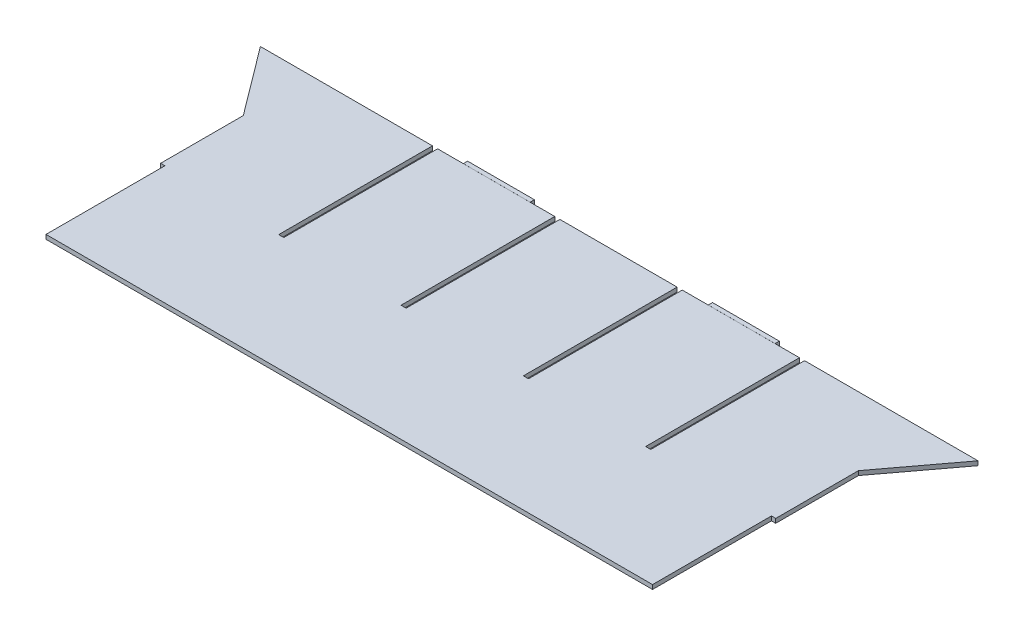
ISO-10303-21;
HEADER;
FILE_DESCRIPTION(('STEP AP214'),'2;1');
FILE_NAME('part.step','',(''),(''),'','','');
FILE_SCHEMA(('AUTOMOTIVE_DESIGN { 1 0 10303 214 1 1 1 1 }'));
ENDSEC;
DATA;
#1=APPLICATION_CONTEXT('core data for automotive mechanical design processes');
#2=APPLICATION_PROTOCOL_DEFINITION('international standard','automotive_design',2000,#1);
#3=PRODUCT_CONTEXT('',#1,'mechanical');
#4=PRODUCT('Part','Part','',(#3));
#5=PRODUCT_RELATED_PRODUCT_CATEGORY('part','',(#4));
#6=PRODUCT_DEFINITION_FORMATION('','',#4);
#7=PRODUCT_DEFINITION_CONTEXT('part definition',#1,'design');
#8=PRODUCT_DEFINITION('design','',#6,#7);
#9=PRODUCT_DEFINITION_SHAPE('','',#8);
#10=(LENGTH_UNIT() NAMED_UNIT(*) SI_UNIT(.MILLI.,.METRE.));
#11=(NAMED_UNIT(*) PLANE_ANGLE_UNIT() SI_UNIT($,.RADIAN.));
#12=(NAMED_UNIT(*) SI_UNIT($,.STERADIAN.) SOLID_ANGLE_UNIT());
#13=UNCERTAINTY_MEASURE_WITH_UNIT(LENGTH_MEASURE(1.E-05),#10,'distance_accuracy_value','');
#14=(GEOMETRIC_REPRESENTATION_CONTEXT(3) GLOBAL_UNCERTAINTY_ASSIGNED_CONTEXT((#13)) GLOBAL_UNIT_ASSIGNED_CONTEXT((#10,
#11,#12)) REPRESENTATION_CONTEXT('',''));
#15=CARTESIAN_POINT('',(0.,0.,0.));
#16=DIRECTION('',(0.,0.,1.));
#17=DIRECTION('',(1.,0.,0.));
#18=AXIS2_PLACEMENT_3D('',#15,#16,#17);
#19=CARTESIAN_POINT('',(0.,0.,0.));
#20=DIRECTION('',(0.,0.,-1.));
#21=DIRECTION('',(-1.,0.,0.));
#22=AXIS2_PLACEMENT_3D('',#19,#20,#21);
#23=PLANE('',#22);
#24=DIRECTION('',(-1.,0.,0.));
#25=VECTOR('',#24,1.);
#26=CARTESIAN_POINT('',(-66.1906883664823,-1.55825959399997,0.));
#27=LINE('',#26,#25);
#28=CARTESIAN_POINT('',(-66.1906883664823,-1.55825959399997,0.));
#29=VERTEX_POINT('',#28);
#30=CARTESIAN_POINT('',(-115.849499972,-1.55825959399997,0.));
#31=VERTEX_POINT('',#30);
#32=EDGE_CURVE('E304',#29,#31,#27,.T.);
#33=ORIENTED_EDGE('',*,*,#32,.F.);
#34=DIRECTION('',(0.,1.,0.));
#35=VECTOR('',#34,1.);
#36=CARTESIAN_POINT('',(-66.1906883664823,0.,0.));
#37=LINE('',#36,#35);
#38=CARTESIAN_POINT('',(-66.1906883664823,1.5875,0.));
#39=VERTEX_POINT('',#38);
#40=EDGE_CURVE('E11',#29,#39,#37,.T.);
#41=ORIENTED_EDGE('',*,*,#40,.T.);
#42=DIRECTION('',(-1.,0.,0.));
#43=VECTOR('',#42,1.);
#44=CARTESIAN_POINT('',(-228.6010033,1.5875,0.));
#45=LINE('',#44,#43);
#46=CARTESIAN_POINT('',(-47.8779967,1.5875,0.));
#47=VERTEX_POINT('',#46);
#48=EDGE_CURVE('E552',#47,#39,#45,.T.);
#49=ORIENTED_EDGE('',*,*,#48,.F.);
#50=DIRECTION('',(0.,1.,0.));
#51=VECTOR('',#50,1.);
#52=CARTESIAN_POINT('',(-47.8779967,-1.5875,0.));
#53=LINE('',#52,#51);
#54=CARTESIAN_POINT('',(-47.8779967,-1.5875,0.));
#55=VERTEX_POINT('',#54);
#56=EDGE_CURVE('E455',#55,#47,#53,.T.);
#57=ORIENTED_EDGE('',*,*,#56,.F.);
#58=DIRECTION('',(1.,0.,0.));
#59=VECTOR('',#58,1.);
#60=CARTESIAN_POINT('',(-228.6010033,-1.5875,0.));
#61=LINE('',#60,#59);
#62=CARTESIAN_POINT('',(-134.9999967,-1.5875,0.));
#63=VERTEX_POINT('',#62);
#64=EDGE_CURVE('E524',#63,#55,#61,.T.);
#65=ORIENTED_EDGE('',*,*,#64,.F.);
#66=DIRECTION('',(0.,1.,0.));
#67=VECTOR('',#66,1.);
#68=CARTESIAN_POINT('',(-134.9999967,-1.5875,0.));
#69=LINE('',#68,#67);
#70=CARTESIAN_POINT('',(-134.9999967,1.5875,0.));
#71=VERTEX_POINT('',#70);
#72=EDGE_CURVE('E468',#63,#71,#69,.T.);
#73=ORIENTED_EDGE('',*,*,#72,.T.);
#74=CARTESIAN_POINT('',(-115.849499972,1.5875,0.));
#75=VERTEX_POINT('',#74);
#76=EDGE_CURVE('E521',#75,#71,#45,.T.);
#77=ORIENTED_EDGE('',*,*,#76,.F.);
#78=DIRECTION('',(0.,1.,0.));
#79=VECTOR('',#78,1.);
#80=CARTESIAN_POINT('',(-115.849499972,1.61674040599999,0.));
#81=LINE('',#80,#79);
#82=EDGE_CURVE('E308',#31,#75,#81,.T.);
#83=ORIENTED_EDGE('',*,*,#82,.F.);
#84=EDGE_LOOP('',(#33,#41,#49,#57,#65,#73,#77,#83));
#85=FACE_BOUND('',#84,.T.);
#86=ADVANCED_FACE('F42',(#85),#23,.T.);
#87=CARTESIAN_POINT('',(66.1906883664823,1.5875,0.));
#88=VERTEX_POINT('',#87);
#89=CARTESIAN_POINT('',(46.8640033,1.5875,0.));
#90=VERTEX_POINT('',#89);
#91=EDGE_CURVE('E550',#88,#90,#45,.T.);
#92=ORIENTED_EDGE('',*,*,#91,.F.);
#93=DIRECTION('',(0.,1.,0.));
#94=VECTOR('',#93,1.);
#95=CARTESIAN_POINT('',(66.1906883664823,1.61674040599999,0.));
#96=LINE('',#95,#94);
#97=CARTESIAN_POINT('',(66.1906883664823,-1.55825959399994,0.));
#98=VERTEX_POINT('',#97);
#99=EDGE_CURVE('E306',#98,#88,#96,.T.);
#100=ORIENTED_EDGE('',*,*,#99,.F.);
#101=DIRECTION('',(-1.,0.,0.));
#102=VECTOR('',#101,1.);
#103=CARTESIAN_POINT('',(66.1906883664823,-1.55825959399994,0.));
#104=LINE('',#103,#102);
#105=CARTESIAN_POINT('',(115.849499972,-1.55825959399997,0.));
#106=VERTEX_POINT('',#105);
#107=EDGE_CURVE('E322',#106,#98,#104,.T.);
#108=ORIENTED_EDGE('',*,*,#107,.F.);
#109=DIRECTION('',(0.,1.,0.));
#110=VECTOR('',#109,1.);
#111=CARTESIAN_POINT('',(115.849499972,0.,0.));
#112=LINE('',#111,#110);
#113=CARTESIAN_POINT('',(115.849499972,1.5875,0.));
#114=VERTEX_POINT('',#113);
#115=EDGE_CURVE('E50',#106,#114,#112,.T.);
#116=ORIENTED_EDGE('',*,*,#115,.T.);
#117=CARTESIAN_POINT('',(133.9860033,1.5875,0.));
#118=VERTEX_POINT('',#117);
#119=EDGE_CURVE('E520',#118,#114,#45,.T.);
#120=ORIENTED_EDGE('',*,*,#119,.F.);
#121=DIRECTION('',(0.,1.,0.));
#122=VECTOR('',#121,1.);
#123=CARTESIAN_POINT('',(133.9860033,-1.5875,0.));
#124=LINE('',#123,#122);
#125=CARTESIAN_POINT('',(133.9860033,-1.5875,0.));
#126=VERTEX_POINT('',#125);
#127=EDGE_CURVE('E505',#126,#118,#124,.T.);
#128=ORIENTED_EDGE('',*,*,#127,.F.);
#129=CARTESIAN_POINT('',(46.8640033,-1.5875,0.));
#130=VERTEX_POINT('',#129);
#131=EDGE_CURVE('E525',#130,#126,#61,.T.);
#132=ORIENTED_EDGE('',*,*,#131,.F.);
#133=DIRECTION('',(0.,1.,0.));
#134=VECTOR('',#133,1.);
#135=CARTESIAN_POINT('',(46.8640033,-1.5875,0.));
#136=LINE('',#135,#134);
#137=EDGE_CURVE('E414',#130,#90,#136,.T.);
#138=ORIENTED_EDGE('',*,*,#137,.T.);
#139=EDGE_LOOP('',(#92,#100,#108,#116,#120,#128,#132,#138));
#140=FACE_BOUND('',#139,.T.);
#141=ADVANCED_FACE('F538',(#140),#23,.T.);
#142=CARTESIAN_POINT('',(228.6010033,-1.5875,200.6419914));
#143=DIRECTION('',(-1.,0.,0.));
#144=DIRECTION('',(0.,0.,1.));
#145=AXIS2_PLACEMENT_3D('',#142,#143,#144);
#146=PLANE('',#145);
#147=DIRECTION('',(0.,-1.,0.));
#148=VECTOR('',#147,1.);
#149=CARTESIAN_POINT('',(228.6010033,1.5875,112.2499914));
#150=LINE('',#149,#148);
#151=CARTESIAN_POINT('',(228.6010033,1.5875,112.2499914));
#152=VERTEX_POINT('',#151);
#153=CARTESIAN_POINT('',(228.6010033,-1.5875,112.2499914));
#154=VERTEX_POINT('',#153);
#155=EDGE_CURVE('E356',#152,#154,#150,.T.);
#156=ORIENTED_EDGE('',*,*,#155,.T.);
#157=DIRECTION('',(0.,0.,-1.));
#158=VECTOR('',#157,1.);
#159=CARTESIAN_POINT('',(228.6010033,-1.5875,200.6419914));
#160=LINE('',#159,#158);
#161=CARTESIAN_POINT('',(228.6010033,-1.5875,50.8));
#162=VERTEX_POINT('',#161);
#163=EDGE_CURVE('E515',#154,#162,#160,.T.);
#164=ORIENTED_EDGE('',*,*,#163,.T.);
#165=DIRECTION('',(0.,-1.,0.));
#166=VECTOR('',#165,1.);
#167=CARTESIAN_POINT('',(228.6010033,1.5875,50.8));
#168=LINE('',#167,#166);
#169=CARTESIAN_POINT('',(228.6010033,1.5875,50.8));
#170=VERTEX_POINT('',#169);
#171=EDGE_CURVE('E387',#170,#162,#168,.T.);
#172=ORIENTED_EDGE('',*,*,#171,.F.);
#173=DIRECTION('',(0.,0.,-1.));
#174=VECTOR('',#173,1.);
#175=CARTESIAN_POINT('',(228.6010033,1.5875,200.6419914));
#176=LINE('',#175,#174);
#177=EDGE_CURVE('E531',#152,#170,#176,.T.);
#178=ORIENTED_EDGE('',*,*,#177,.F.);
#179=EDGE_LOOP('',(#156,#164,#172,#178));
#180=FACE_BOUND('',#179,.T.);
#181=ADVANCED_FACE('F44',(#180),#146,.F.);
#182=CARTESIAN_POINT('',(-228.6010033,1.5875,200.6419914));
#183=DIRECTION('',(0.,-1.,0.));
#184=DIRECTION('',(0.,0.,-1.));
#185=AXIS2_PLACEMENT_3D('',#182,#183,#184);
#186=PLANE('',#185);
#187=DIRECTION('',(-1.,0.,0.));
#188=VECTOR('',#187,1.);
#189=CARTESIAN_POINT('',(228.6010033,1.5875,112.2499914));
#190=LINE('',#189,#188);
#191=CARTESIAN_POINT('',(225.4260033,1.5875,112.2499914));
#192=VERTEX_POINT('',#191);
#193=EDGE_CURVE('E348',#152,#192,#190,.T.);
#194=ORIENTED_EDGE('',*,*,#193,.F.);
#195=ORIENTED_EDGE('',*,*,#177,.T.);
#196=DIRECTION('',(0.600000000000001,0.,-0.799999999999999));
#197=VECTOR('',#196,1.);
#198=CARTESIAN_POINT('',(266.7010033,1.5875,0.));
#199=LINE('',#198,#197);
#200=CARTESIAN_POINT('',(266.7010033,1.5875,0.));
#201=VERTEX_POINT('',#200);
#202=EDGE_CURVE('E381',#170,#201,#199,.T.);
#203=ORIENTED_EDGE('',*,*,#202,.T.);
#204=CARTESIAN_POINT('',(137.7960033,1.5875,0.));
#205=VERTEX_POINT('',#204);
#206=EDGE_CURVE('E516',#201,#205,#45,.T.);
#207=ORIENTED_EDGE('',*,*,#206,.T.);
#208=DIRECTION('',(0.,0.,1.));
#209=VECTOR('',#208,1.);
#210=CARTESIAN_POINT('',(137.7960033,1.5875,0.));
#211=LINE('',#210,#209);
#212=CARTESIAN_POINT('',(137.7960033,1.5875,114.3));
#213=VERTEX_POINT('',#212);
#214=EDGE_CURVE('E426',#205,#213,#211,.T.);
#215=ORIENTED_EDGE('',*,*,#214,.T.);
#216=DIRECTION('',(1.,0.,0.));
#217=VECTOR('',#216,1.);
#218=CARTESIAN_POINT('',(0.,1.5875,114.3));
#219=LINE('',#218,#217);
#220=CARTESIAN_POINT('',(133.9860033,1.5875,114.3));
#221=VERTEX_POINT('',#220);
#222=EDGE_CURVE('E486',#221,#213,#219,.T.);
#223=ORIENTED_EDGE('',*,*,#222,.F.);
#224=DIRECTION('',(0.,0.,1.));
#225=VECTOR('',#224,1.);
#226=CARTESIAN_POINT('',(133.9860033,1.5875,0.));
#227=LINE('',#226,#225);
#228=EDGE_CURVE('E495',#118,#221,#227,.T.);
#229=ORIENTED_EDGE('',*,*,#228,.F.);
#230=ORIENTED_EDGE('',*,*,#119,.T.);
#231=EDGE_CURVE('E547',#114,#88,#45,.T.);
#232=ORIENTED_EDGE('',*,*,#231,.T.);
#233=ORIENTED_EDGE('',*,*,#91,.T.);
#234=DIRECTION('',(0.,0.,1.));
#235=VECTOR('',#234,1.);
#236=CARTESIAN_POINT('',(46.8640033,1.5875,0.));
#237=LINE('',#236,#235);
#238=CARTESIAN_POINT('',(46.8640033,1.5875,114.3));
#239=VERTEX_POINT('',#238);
#240=EDGE_CURVE('E415',#90,#239,#237,.T.);
#241=ORIENTED_EDGE('',*,*,#240,.T.);
#242=DIRECTION('',(1.,0.,0.));
#243=VECTOR('',#242,1.);
#244=CARTESIAN_POINT('',(-90.932,1.5875,114.3));
#245=LINE('',#244,#243);
#246=CARTESIAN_POINT('',(43.0540033,1.5875,114.3));
#247=VERTEX_POINT('',#246);
#248=EDGE_CURVE('E408',#247,#239,#245,.T.);
#249=ORIENTED_EDGE('',*,*,#248,.F.);
#250=DIRECTION('',(0.,0.,1.));
#251=VECTOR('',#250,1.);
#252=CARTESIAN_POINT('',(43.0540033,1.5875,0.));
#253=LINE('',#252,#251);
#254=CARTESIAN_POINT('',(43.0540033,1.5875,0.));
#255=VERTEX_POINT('',#254);
#256=EDGE_CURVE('E418',#255,#247,#253,.T.);
#257=ORIENTED_EDGE('',*,*,#256,.F.);
#258=CARTESIAN_POINT('',(-44.0679967,1.5875,0.));
#259=VERTEX_POINT('',#258);
#260=EDGE_CURVE('E549',#255,#259,#45,.T.);
#261=ORIENTED_EDGE('',*,*,#260,.T.);
#262=DIRECTION('',(0.,0.,1.));
#263=VECTOR('',#262,1.);
#264=CARTESIAN_POINT('',(-44.0679967,1.5875,0.));
#265=LINE('',#264,#263);
#266=CARTESIAN_POINT('',(-44.0679967,1.5875,114.3));
#267=VERTEX_POINT('',#266);
#268=EDGE_CURVE('E443',#259,#267,#265,.T.);
#269=ORIENTED_EDGE('',*,*,#268,.T.);
#270=DIRECTION('',(1.,0.,0.));
#271=VECTOR('',#270,1.);
#272=CARTESIAN_POINT('',(-181.864,1.5875,114.3));
#273=LINE('',#272,#271);
#274=CARTESIAN_POINT('',(-47.8779967,1.5875,114.3));
#275=VERTEX_POINT('',#274);
#276=EDGE_CURVE('E436',#275,#267,#273,.T.);
#277=ORIENTED_EDGE('',*,*,#276,.F.);
#278=DIRECTION('',(0.,0.,1.));
#279=VECTOR('',#278,1.);
#280=CARTESIAN_POINT('',(-47.8779967,1.5875,0.));
#281=LINE('',#280,#279);
#282=EDGE_CURVE('E446',#47,#275,#281,.T.);
#283=ORIENTED_EDGE('',*,*,#282,.F.);
#284=ORIENTED_EDGE('',*,*,#48,.T.);
#285=EDGE_CURVE('E302',#39,#75,#45,.T.);
#286=ORIENTED_EDGE('',*,*,#285,.T.);
#287=ORIENTED_EDGE('',*,*,#76,.T.);
#288=DIRECTION('',(0.,0.,1.));
#289=VECTOR('',#288,1.);
#290=CARTESIAN_POINT('',(-134.9999967,1.5875,0.));
#291=LINE('',#290,#289);
#292=CARTESIAN_POINT('',(-134.9999967,1.5875,114.3));
#293=VERTEX_POINT('',#292);
#294=EDGE_CURVE('E402',#71,#293,#291,.T.);
#295=ORIENTED_EDGE('',*,*,#294,.T.);
#296=DIRECTION('',(1.,0.,0.));
#297=VECTOR('',#296,1.);
#298=CARTESIAN_POINT('',(-272.796,1.5875,114.3));
#299=LINE('',#298,#297);
#300=CARTESIAN_POINT('',(-138.8099967,1.5875,114.3));
#301=VERTEX_POINT('',#300);
#302=EDGE_CURVE('E462',#301,#293,#299,.T.);
#303=ORIENTED_EDGE('',*,*,#302,.F.);
#304=DIRECTION('',(0.,0.,1.));
#305=VECTOR('',#304,1.);
#306=CARTESIAN_POINT('',(-138.8099967,1.5875,0.));
#307=LINE('',#306,#305);
#308=CARTESIAN_POINT('',(-138.8099967,1.5875,0.));
#309=VERTEX_POINT('',#308);
#310=EDGE_CURVE('E471',#309,#301,#307,.T.);
#311=ORIENTED_EDGE('',*,*,#310,.F.);
#312=CARTESIAN_POINT('',(-266.7010033,1.5875,0.));
#313=VERTEX_POINT('',#312);
#314=EDGE_CURVE('E502',#309,#313,#45,.T.);
#315=ORIENTED_EDGE('',*,*,#314,.T.);
#316=DIRECTION('',(-0.600000000000001,0.,-0.799999999999999));
#317=VECTOR('',#316,1.);
#318=CARTESIAN_POINT('',(-266.7010033,1.5875,0.));
#319=LINE('',#318,#317);
#320=CARTESIAN_POINT('',(-228.6010033,1.5875,50.8));
#321=VERTEX_POINT('',#320);
#322=EDGE_CURVE('E393',#321,#313,#319,.T.);
#323=ORIENTED_EDGE('',*,*,#322,.F.);
#324=DIRECTION('',(0.,0.,-1.));
#325=VECTOR('',#324,1.);
#326=CARTESIAN_POINT('',(-228.6010033,1.5875,200.6419914));
#327=LINE('',#326,#325);
#328=CARTESIAN_POINT('',(-228.6010033,1.5875,112.2499914));
#329=VERTEX_POINT('',#328);
#330=EDGE_CURVE('E529',#329,#321,#327,.T.);
#331=ORIENTED_EDGE('',*,*,#330,.F.);
#332=DIRECTION('',(1.,0.,0.));
#333=VECTOR('',#332,1.);
#334=CARTESIAN_POINT('',(-228.6010033,1.5875,112.2499914));
#335=LINE('',#334,#333);
#336=CARTESIAN_POINT('',(-225.4260033,1.5875,112.2499914));
#337=VERTEX_POINT('',#336);
#338=EDGE_CURVE('E363',#329,#337,#335,.T.);
#339=ORIENTED_EDGE('',*,*,#338,.T.);
#340=DIRECTION('',(0.,0.,1.));
#341=VECTOR('',#340,1.);
#342=CARTESIAN_POINT('',(-225.4260033,1.5875,200.6419914));
#343=LINE('',#342,#341);
#344=CARTESIAN_POINT('',(-225.4260033,1.5875,200.6419914));
#345=VERTEX_POINT('',#344);
#346=EDGE_CURVE('E366',#337,#345,#343,.T.);
#347=ORIENTED_EDGE('',*,*,#346,.T.);
#348=DIRECTION('',(-1.,0.,0.));
#349=VECTOR('',#348,1.);
#350=CARTESIAN_POINT('',(-228.6010033,1.5875,200.6419914));
#351=LINE('',#350,#349);
#352=CARTESIAN_POINT('',(225.4260033,1.5875,200.6419914));
#353=VERTEX_POINT('',#352);
#354=EDGE_CURVE('E509',#353,#345,#351,.T.);
#355=ORIENTED_EDGE('',*,*,#354,.F.);
#356=DIRECTION('',(0.,0.,1.));
#357=VECTOR('',#356,1.);
#358=CARTESIAN_POINT('',(225.4260033,1.5875,200.6419914));
#359=LINE('',#358,#357);
#360=EDGE_CURVE('E346',#192,#353,#359,.T.);
#361=ORIENTED_EDGE('',*,*,#360,.F.);
#362=EDGE_LOOP('',(#194,#195,#203,#207,#215,#223,#229,#230,#232,#233,#241,#249,#257,#261,#269,
#277,#283,#284,#286,#287,#295,#303,#311,#315,#323,#331,#339,#347,#355,#361));
#363=FACE_BOUND('',#362,.T.);
#364=ADVANCED_FACE('F546',(#363),#186,.F.);
#365=CARTESIAN_POINT('',(-228.6010033,-1.5875,200.6419914));
#366=DIRECTION('',(0.,1.,0.));
#367=DIRECTION('',(0.,0.,1.));
#368=AXIS2_PLACEMENT_3D('',#365,#366,#367);
#369=PLANE('',#368);
#370=DIRECTION('',(-1.,0.,0.));
#371=VECTOR('',#370,1.);
#372=CARTESIAN_POINT('',(228.6010033,-1.5875,112.2499914));
#373=LINE('',#372,#371);
#374=CARTESIAN_POINT('',(225.4260033,-1.5875,112.2499914));
#375=VERTEX_POINT('',#374);
#376=EDGE_CURVE('E349',#154,#375,#373,.T.);
#377=ORIENTED_EDGE('',*,*,#376,.T.);
#378=DIRECTION('',(0.,0.,1.));
#379=VECTOR('',#378,1.);
#380=CARTESIAN_POINT('',(225.4260033,-1.5875,200.6419914));
#381=LINE('',#380,#379);
#382=CARTESIAN_POINT('',(225.4260033,-1.5875,200.6419914));
#383=VERTEX_POINT('',#382);
#384=EDGE_CURVE('E345',#375,#383,#381,.T.);
#385=ORIENTED_EDGE('',*,*,#384,.T.);
#386=DIRECTION('',(1.,0.,0.));
#387=VECTOR('',#386,1.);
#388=CARTESIAN_POINT('',(-228.6010033,-1.5875,200.6419914));
#389=LINE('',#388,#387);
#390=CARTESIAN_POINT('',(-225.4260033,-1.5875,200.6419914));
#391=VERTEX_POINT('',#390);
#392=EDGE_CURVE('E511',#391,#383,#389,.T.);
#393=ORIENTED_EDGE('',*,*,#392,.F.);
#394=DIRECTION('',(0.,0.,1.));
#395=VECTOR('',#394,1.);
#396=CARTESIAN_POINT('',(-225.4260033,-1.5875,200.6419914));
#397=LINE('',#396,#395);
#398=CARTESIAN_POINT('',(-225.4260033,-1.5875,112.2499914));
#399=VERTEX_POINT('',#398);
#400=EDGE_CURVE('E367',#399,#391,#397,.T.);
#401=ORIENTED_EDGE('',*,*,#400,.F.);
#402=DIRECTION('',(1.,0.,0.));
#403=VECTOR('',#402,1.);
#404=CARTESIAN_POINT('',(-228.6010033,-1.5875,112.2499914));
#405=LINE('',#404,#403);
#406=CARTESIAN_POINT('',(-228.6010033,-1.5875,112.2499914));
#407=VERTEX_POINT('',#406);
#408=EDGE_CURVE('E359',#407,#399,#405,.T.);
#409=ORIENTED_EDGE('',*,*,#408,.F.);
#410=DIRECTION('',(0.,0.,-1.));
#411=VECTOR('',#410,1.);
#412=CARTESIAN_POINT('',(-228.6010033,-1.5875,200.6419914));
#413=LINE('',#412,#411);
#414=CARTESIAN_POINT('',(-228.6010033,-1.5875,50.8));
#415=VERTEX_POINT('',#414);
#416=EDGE_CURVE('E527',#407,#415,#413,.T.);
#417=ORIENTED_EDGE('',*,*,#416,.T.);
#418=DIRECTION('',(-0.600000000000001,0.,-0.799999999999999));
#419=VECTOR('',#418,1.);
#420=CARTESIAN_POINT('',(-266.7010033,-1.5875,0.));
#421=LINE('',#420,#419);
#422=CARTESIAN_POINT('',(-266.7010033,-1.5875,0.));
#423=VERTEX_POINT('',#422);
#424=EDGE_CURVE('E390',#415,#423,#421,.T.);
#425=ORIENTED_EDGE('',*,*,#424,.T.);
#426=CARTESIAN_POINT('',(-138.8099967,-1.5875,0.));
#427=VERTEX_POINT('',#426);
#428=EDGE_CURVE('E512',#423,#427,#61,.T.);
#429=ORIENTED_EDGE('',*,*,#428,.T.);
#430=DIRECTION('',(0.,0.,1.));
#431=VECTOR('',#430,1.);
#432=CARTESIAN_POINT('',(-138.8099967,-1.5875,0.));
#433=LINE('',#432,#431);
#434=CARTESIAN_POINT('',(-138.8099967,-1.5875,114.3));
#435=VERTEX_POINT('',#434);
#436=EDGE_CURVE('E461',#427,#435,#433,.T.);
#437=ORIENTED_EDGE('',*,*,#436,.T.);
#438=DIRECTION('',(1.,0.,0.));
#439=VECTOR('',#438,1.);
#440=CARTESIAN_POINT('',(-272.796,-1.5875,114.3));
#441=LINE('',#440,#439);
#442=CARTESIAN_POINT('',(-134.9999967,-1.5875,114.3));
#443=VERTEX_POINT('',#442);
#444=EDGE_CURVE('E465',#435,#443,#441,.T.);
#445=ORIENTED_EDGE('',*,*,#444,.T.);
#446=DIRECTION('',(0.,0.,1.));
#447=VECTOR('',#446,1.);
#448=CARTESIAN_POINT('',(-134.9999967,-1.5875,0.));
#449=LINE('',#448,#447);
#450=EDGE_CURVE('E459',#63,#443,#449,.T.);
#451=ORIENTED_EDGE('',*,*,#450,.F.);
#452=ORIENTED_EDGE('',*,*,#64,.T.);
#453=DIRECTION('',(0.,0.,1.));
#454=VECTOR('',#453,1.);
#455=CARTESIAN_POINT('',(-47.8779967,-1.5875,0.));
#456=LINE('',#455,#454);
#457=CARTESIAN_POINT('',(-47.8779967,-1.5875,114.3));
#458=VERTEX_POINT('',#457);
#459=EDGE_CURVE('E435',#55,#458,#456,.T.);
#460=ORIENTED_EDGE('',*,*,#459,.T.);
#461=DIRECTION('',(1.,0.,0.));
#462=VECTOR('',#461,1.);
#463=CARTESIAN_POINT('',(-181.864,-1.5875,114.3));
#464=LINE('',#463,#462);
#465=CARTESIAN_POINT('',(-44.0679967,-1.5875,114.3));
#466=VERTEX_POINT('',#465);
#467=EDGE_CURVE('E439',#458,#466,#464,.T.);
#468=ORIENTED_EDGE('',*,*,#467,.T.);
#469=DIRECTION('',(0.,0.,1.));
#470=VECTOR('',#469,1.);
#471=CARTESIAN_POINT('',(-44.0679967,-1.5875,0.));
#472=LINE('',#471,#470);
#473=CARTESIAN_POINT('',(-44.0679967,-1.5875,0.));
#474=VERTEX_POINT('',#473);
#475=EDGE_CURVE('E433',#474,#466,#472,.T.);
#476=ORIENTED_EDGE('',*,*,#475,.F.);
#477=CARTESIAN_POINT('',(43.0540033,-1.5875,0.));
#478=VERTEX_POINT('',#477);
#479=EDGE_CURVE('E576',#474,#478,#61,.T.);
#480=ORIENTED_EDGE('',*,*,#479,.T.);
#481=DIRECTION('',(0.,0.,1.));
#482=VECTOR('',#481,1.);
#483=CARTESIAN_POINT('',(43.0540033,-1.5875,0.));
#484=LINE('',#483,#482);
#485=CARTESIAN_POINT('',(43.0540033,-1.5875,114.3));
#486=VERTEX_POINT('',#485);
#487=EDGE_CURVE('E407',#478,#486,#484,.T.);
#488=ORIENTED_EDGE('',*,*,#487,.T.);
#489=DIRECTION('',(1.,0.,0.));
#490=VECTOR('',#489,1.);
#491=CARTESIAN_POINT('',(-90.932,-1.5875,114.3));
#492=LINE('',#491,#490);
#493=CARTESIAN_POINT('',(46.8640033,-1.5875,114.3));
#494=VERTEX_POINT('',#493);
#495=EDGE_CURVE('E411',#486,#494,#492,.T.);
#496=ORIENTED_EDGE('',*,*,#495,.T.);
#497=DIRECTION('',(0.,0.,1.));
#498=VECTOR('',#497,1.);
#499=CARTESIAN_POINT('',(46.8640033,-1.5875,0.));
#500=LINE('',#499,#498);
#501=EDGE_CURVE('E405',#130,#494,#500,.T.);
#502=ORIENTED_EDGE('',*,*,#501,.F.);
#503=ORIENTED_EDGE('',*,*,#131,.T.);
#504=DIRECTION('',(0.,0.,1.));
#505=VECTOR('',#504,1.);
#506=CARTESIAN_POINT('',(133.9860033,-1.5875,0.));
#507=LINE('',#506,#505);
#508=CARTESIAN_POINT('',(133.9860033,-1.5875,114.3));
#509=VERTEX_POINT('',#508);
#510=EDGE_CURVE('E485',#126,#509,#507,.T.);
#511=ORIENTED_EDGE('',*,*,#510,.T.);
#512=DIRECTION('',(1.,0.,0.));
#513=VECTOR('',#512,1.);
#514=CARTESIAN_POINT('',(0.,-1.5875,114.3));
#515=LINE('',#514,#513);
#516=CARTESIAN_POINT('',(137.7960033,-1.5875,114.3));
#517=VERTEX_POINT('',#516);
#518=EDGE_CURVE('E489',#509,#517,#515,.T.);
#519=ORIENTED_EDGE('',*,*,#518,.T.);
#520=DIRECTION('',(0.,0.,1.));
#521=VECTOR('',#520,1.);
#522=CARTESIAN_POINT('',(137.7960033,-1.5875,0.));
#523=LINE('',#522,#521);
#524=CARTESIAN_POINT('',(137.7960033,-1.5875,0.));
#525=VERTEX_POINT('',#524);
#526=EDGE_CURVE('E483',#525,#517,#523,.T.);
#527=ORIENTED_EDGE('',*,*,#526,.F.);
#528=CARTESIAN_POINT('',(266.7010033,-1.5875,0.));
#529=VERTEX_POINT('',#528);
#530=EDGE_CURVE('E519',#525,#529,#61,.T.);
#531=ORIENTED_EDGE('',*,*,#530,.T.);
#532=DIRECTION('',(0.600000000000001,0.,-0.799999999999999));
#533=VECTOR('',#532,1.);
#534=CARTESIAN_POINT('',(266.7010033,-1.5875,0.));
#535=LINE('',#534,#533);
#536=EDGE_CURVE('E377',#162,#529,#535,.T.);
#537=ORIENTED_EDGE('',*,*,#536,.F.);
#538=ORIENTED_EDGE('',*,*,#163,.F.);
#539=EDGE_LOOP('',(#377,#385,#393,#401,#409,#417,#425,#429,#437,#445,#451,#452,#460,#468,#476,
#480,#488,#496,#502,#503,#511,#519,#527,#531,#537,#538));
#540=FACE_BOUND('',#539,.T.);
#541=ADVANCED_FACE('F584',(#540),#369,.F.);
#542=CARTESIAN_POINT('',(0.,0.,200.6419914));
#543=DIRECTION('',(0.,0.,-1.));
#544=DIRECTION('',(-1.,0.,0.));
#545=AXIS2_PLACEMENT_3D('',#542,#543,#544);
#546=PLANE('',#545);
#547=DIRECTION('',(0.,-1.,0.));
#548=VECTOR('',#547,1.);
#549=CARTESIAN_POINT('',(225.4260033,1.5875,200.6419914));
#550=LINE('',#549,#548);
#551=EDGE_CURVE('E351',#353,#383,#550,.T.);
#552=ORIENTED_EDGE('',*,*,#551,.F.);
#553=ORIENTED_EDGE('',*,*,#354,.T.);
#554=DIRECTION('',(0.,-1.,0.));
#555=VECTOR('',#554,1.);
#556=CARTESIAN_POINT('',(-225.4260033,1.5875,200.6419914));
#557=LINE('',#556,#555);
#558=EDGE_CURVE('E374',#345,#391,#557,.T.);
#559=ORIENTED_EDGE('',*,*,#558,.T.);
#560=ORIENTED_EDGE('',*,*,#392,.T.);
#561=EDGE_LOOP('',(#552,#553,#559,#560));
#562=FACE_BOUND('',#561,.T.);
#563=ADVANCED_FACE('F612',(#562),#546,.F.);
#564=DIRECTION('',(0.,1.,0.));
#565=VECTOR('',#564,1.);
#566=CARTESIAN_POINT('',(43.0540033,-1.5875,0.));
#567=LINE('',#566,#565);
#568=EDGE_CURVE('E429',#478,#255,#567,.T.);
#569=ORIENTED_EDGE('',*,*,#568,.F.);
#570=ORIENTED_EDGE('',*,*,#479,.F.);
#571=DIRECTION('',(0.,1.,0.));
#572=VECTOR('',#571,1.);
#573=CARTESIAN_POINT('',(-44.0679967,-1.5875,0.));
#574=LINE('',#573,#572);
#575=EDGE_CURVE('E442',#474,#259,#574,.T.);
#576=ORIENTED_EDGE('',*,*,#575,.T.);
#577=ORIENTED_EDGE('',*,*,#260,.F.);
#578=EDGE_LOOP('',(#569,#570,#576,#577));
#579=FACE_BOUND('',#578,.T.);
#580=ADVANCED_FACE('F655',(#579),#23,.T.);
#581=ORIENTED_EDGE('',*,*,#530,.F.);
#582=DIRECTION('',(0.,1.,0.));
#583=VECTOR('',#582,1.);
#584=CARTESIAN_POINT('',(137.7960033,-1.5875,0.));
#585=LINE('',#584,#583);
#586=EDGE_CURVE('E492',#525,#205,#585,.T.);
#587=ORIENTED_EDGE('',*,*,#586,.T.);
#588=ORIENTED_EDGE('',*,*,#206,.F.);
#589=DIRECTION('',(0.,-1.,0.));
#590=VECTOR('',#589,1.);
#591=CARTESIAN_POINT('',(266.7010033,1.5875,0.));
#592=LINE('',#591,#590);
#593=EDGE_CURVE('E384',#201,#529,#592,.T.);
#594=ORIENTED_EDGE('',*,*,#593,.T.);
#595=EDGE_LOOP('',(#581,#587,#588,#594));
#596=FACE_BOUND('',#595,.T.);
#597=ADVANCED_FACE('F593',(#596),#23,.T.);
#598=CARTESIAN_POINT('',(-228.6010033,-1.5875,200.6419914));
#599=DIRECTION('',(1.,0.,0.));
#600=DIRECTION('',(0.,0.,-1.));
#601=AXIS2_PLACEMENT_3D('',#598,#599,#600);
#602=PLANE('',#601);
#603=ORIENTED_EDGE('',*,*,#416,.F.);
#604=DIRECTION('',(0.,-1.,0.));
#605=VECTOR('',#604,1.);
#606=CARTESIAN_POINT('',(-228.6010033,1.5875,112.2499914));
#607=LINE('',#606,#605);
#608=EDGE_CURVE('E370',#329,#407,#607,.T.);
#609=ORIENTED_EDGE('',*,*,#608,.F.);
#610=ORIENTED_EDGE('',*,*,#330,.T.);
#611=DIRECTION('',(0.,-1.,0.));
#612=VECTOR('',#611,1.);
#613=CARTESIAN_POINT('',(-228.6010033,1.5875,50.8));
#614=LINE('',#613,#612);
#615=EDGE_CURVE('E396',#321,#415,#614,.T.);
#616=ORIENTED_EDGE('',*,*,#615,.T.);
#617=EDGE_LOOP('',(#603,#609,#610,#616));
#618=FACE_BOUND('',#617,.T.);
#619=ADVANCED_FACE('F626',(#618),#602,.F.);
#620=DIRECTION('',(0.,1.,0.));
#621=VECTOR('',#620,1.);
#622=CARTESIAN_POINT('',(-138.8099967,-1.5875,0.));
#623=LINE('',#622,#621);
#624=EDGE_CURVE('E479',#427,#309,#623,.T.);
#625=ORIENTED_EDGE('',*,*,#624,.F.);
#626=ORIENTED_EDGE('',*,*,#428,.F.);
#627=DIRECTION('',(0.,-1.,0.));
#628=VECTOR('',#627,1.);
#629=CARTESIAN_POINT('',(-266.7010033,1.5875,0.));
#630=LINE('',#629,#628);
#631=EDGE_CURVE('E399',#313,#423,#630,.T.);
#632=ORIENTED_EDGE('',*,*,#631,.F.);
#633=ORIENTED_EDGE('',*,*,#314,.F.);
#634=EDGE_LOOP('',(#625,#626,#632,#633));
#635=FACE_BOUND('',#634,.T.);
#636=ADVANCED_FACE('F633',(#635),#23,.T.);
#637=CARTESIAN_POINT('',(137.7960033,-1.5875,0.));
#638=DIRECTION('',(-1.,0.,0.));
#639=DIRECTION('',(0.,0.,1.));
#640=AXIS2_PLACEMENT_3D('',#637,#638,#639);
#641=PLANE('',#640);
#642=ORIENTED_EDGE('',*,*,#214,.F.);
#643=ORIENTED_EDGE('',*,*,#586,.F.);
#644=ORIENTED_EDGE('',*,*,#526,.T.);
#645=DIRECTION('',(0.,1.,0.));
#646=VECTOR('',#645,1.);
#647=CARTESIAN_POINT('',(137.7960033,-1.5875,114.3));
#648=LINE('',#647,#646);
#649=EDGE_CURVE('E500',#517,#213,#648,.T.);
#650=ORIENTED_EDGE('',*,*,#649,.T.);
#651=EDGE_LOOP('',(#642,#643,#644,#650));
#652=FACE_BOUND('',#651,.T.);
#653=ADVANCED_FACE('F659',(#652),#641,.T.);
#654=CARTESIAN_POINT('',(0.,-1.5875,114.3));
#655=DIRECTION('',(0.,0.,1.));
#656=DIRECTION('',(1.,0.,0.));
#657=AXIS2_PLACEMENT_3D('',#654,#655,#656);
#658=PLANE('',#657);
#659=ORIENTED_EDGE('',*,*,#222,.T.);
#660=ORIENTED_EDGE('',*,*,#649,.F.);
#661=ORIENTED_EDGE('',*,*,#518,.F.);
#662=DIRECTION('',(0.,1.,0.));
#663=VECTOR('',#662,1.);
#664=CARTESIAN_POINT('',(133.9860033,-1.5875,114.3));
#665=LINE('',#664,#663);
#666=EDGE_CURVE('E503',#509,#221,#665,.T.);
#667=ORIENTED_EDGE('',*,*,#666,.T.);
#668=EDGE_LOOP('',(#659,#660,#661,#667));
#669=FACE_BOUND('',#668,.T.);
#670=ADVANCED_FACE('F590',(#669),#658,.F.);
#671=CARTESIAN_POINT('',(133.9860033,-1.5875,0.));
#672=DIRECTION('',(-1.,0.,0.));
#673=DIRECTION('',(0.,0.,1.));
#674=AXIS2_PLACEMENT_3D('',#671,#672,#673);
#675=PLANE('',#674);
#676=ORIENTED_EDGE('',*,*,#228,.T.);
#677=ORIENTED_EDGE('',*,*,#666,.F.);
#678=ORIENTED_EDGE('',*,*,#510,.F.);
#679=ORIENTED_EDGE('',*,*,#127,.T.);
#680=EDGE_LOOP('',(#676,#677,#678,#679));
#681=FACE_BOUND('',#680,.T.);
#682=ADVANCED_FACE('F586',(#681),#675,.F.);
#683=CARTESIAN_POINT('',(-134.9999967,-1.5875,0.));
#684=DIRECTION('',(-1.,0.,0.));
#685=DIRECTION('',(0.,0.,1.));
#686=AXIS2_PLACEMENT_3D('',#683,#684,#685);
#687=PLANE('',#686);
#688=ORIENTED_EDGE('',*,*,#294,.F.);
#689=ORIENTED_EDGE('',*,*,#72,.F.);
#690=ORIENTED_EDGE('',*,*,#450,.T.);
#691=DIRECTION('',(0.,1.,0.));
#692=VECTOR('',#691,1.);
#693=CARTESIAN_POINT('',(-134.9999967,-1.5875,114.3));
#694=LINE('',#693,#692);
#695=EDGE_CURVE('E447',#443,#293,#694,.T.);
#696=ORIENTED_EDGE('',*,*,#695,.T.);
#697=EDGE_LOOP('',(#688,#689,#690,#696));
#698=FACE_BOUND('',#697,.T.);
#699=ADVANCED_FACE('F568',(#698),#687,.T.);
#700=CARTESIAN_POINT('',(-272.796,-1.5875,114.3));
#701=DIRECTION('',(0.,0.,1.));
#702=DIRECTION('',(1.,0.,0.));
#703=AXIS2_PLACEMENT_3D('',#700,#701,#702);
#704=PLANE('',#703);
#705=ORIENTED_EDGE('',*,*,#302,.T.);
#706=ORIENTED_EDGE('',*,*,#695,.F.);
#707=ORIENTED_EDGE('',*,*,#444,.F.);
#708=DIRECTION('',(0.,1.,0.));
#709=VECTOR('',#708,1.);
#710=CARTESIAN_POINT('',(-138.8099967,-1.5875,114.3));
#711=LINE('',#710,#709);
#712=EDGE_CURVE('E477',#435,#301,#711,.T.);
#713=ORIENTED_EDGE('',*,*,#712,.T.);
#714=EDGE_LOOP('',(#705,#706,#707,#713));
#715=FACE_BOUND('',#714,.T.);
#716=ADVANCED_FACE('F637',(#715),#704,.F.);
#717=CARTESIAN_POINT('',(-138.8099967,-1.5875,0.));
#718=DIRECTION('',(-1.,0.,0.));
#719=DIRECTION('',(0.,0.,1.));
#720=AXIS2_PLACEMENT_3D('',#717,#718,#719);
#721=PLANE('',#720);
#722=ORIENTED_EDGE('',*,*,#310,.T.);
#723=ORIENTED_EDGE('',*,*,#712,.F.);
#724=ORIENTED_EDGE('',*,*,#436,.F.);
#725=ORIENTED_EDGE('',*,*,#624,.T.);
#726=EDGE_LOOP('',(#722,#723,#724,#725));
#727=FACE_BOUND('',#726,.T.);
#728=ADVANCED_FACE('F635',(#727),#721,.F.);
#729=CARTESIAN_POINT('',(-44.0679967,-1.5875,0.));
#730=DIRECTION('',(-1.,0.,0.));
#731=DIRECTION('',(0.,0.,1.));
#732=AXIS2_PLACEMENT_3D('',#729,#730,#731);
#733=PLANE('',#732);
#734=ORIENTED_EDGE('',*,*,#268,.F.);
#735=ORIENTED_EDGE('',*,*,#575,.F.);
#736=ORIENTED_EDGE('',*,*,#475,.T.);
#737=DIRECTION('',(0.,1.,0.));
#738=VECTOR('',#737,1.);
#739=CARTESIAN_POINT('',(-44.0679967,-1.5875,114.3));
#740=LINE('',#739,#738);
#741=EDGE_CURVE('E419',#466,#267,#740,.T.);
#742=ORIENTED_EDGE('',*,*,#741,.T.);
#743=EDGE_LOOP('',(#734,#735,#736,#742));
#744=FACE_BOUND('',#743,.T.);
#745=ADVANCED_FACE('F645',(#744),#733,.T.);
#746=CARTESIAN_POINT('',(-181.864,-1.5875,114.3));
#747=DIRECTION('',(0.,0.,1.));
#748=DIRECTION('',(1.,0.,0.));
#749=AXIS2_PLACEMENT_3D('',#746,#747,#748);
#750=PLANE('',#749);
#751=ORIENTED_EDGE('',*,*,#276,.T.);
#752=ORIENTED_EDGE('',*,*,#741,.F.);
#753=ORIENTED_EDGE('',*,*,#467,.F.);
#754=DIRECTION('',(0.,1.,0.));
#755=VECTOR('',#754,1.);
#756=CARTESIAN_POINT('',(-47.8779967,-1.5875,114.3));
#757=LINE('',#756,#755);
#758=EDGE_CURVE('E453',#458,#275,#757,.T.);
#759=ORIENTED_EDGE('',*,*,#758,.T.);
#760=EDGE_LOOP('',(#751,#752,#753,#759));
#761=FACE_BOUND('',#760,.T.);
#762=ADVANCED_FACE('F686',(#761),#750,.F.);
#763=CARTESIAN_POINT('',(-47.8779967,-1.5875,0.));
#764=DIRECTION('',(-1.,0.,0.));
#765=DIRECTION('',(0.,0.,1.));
#766=AXIS2_PLACEMENT_3D('',#763,#764,#765);
#767=PLANE('',#766);
#768=ORIENTED_EDGE('',*,*,#282,.T.);
#769=ORIENTED_EDGE('',*,*,#758,.F.);
#770=ORIENTED_EDGE('',*,*,#459,.F.);
#771=ORIENTED_EDGE('',*,*,#56,.T.);
#772=EDGE_LOOP('',(#768,#769,#770,#771));
#773=FACE_BOUND('',#772,.T.);
#774=ADVANCED_FACE('F747',(#773),#767,.F.);
#775=CARTESIAN_POINT('',(46.8640033,-1.5875,0.));
#776=DIRECTION('',(-1.,0.,0.));
#777=DIRECTION('',(0.,0.,1.));
#778=AXIS2_PLACEMENT_3D('',#775,#776,#777);
#779=PLANE('',#778);
#780=ORIENTED_EDGE('',*,*,#240,.F.);
#781=ORIENTED_EDGE('',*,*,#137,.F.);
#782=ORIENTED_EDGE('',*,*,#501,.T.);
#783=DIRECTION('',(0.,1.,0.));
#784=VECTOR('',#783,1.);
#785=CARTESIAN_POINT('',(46.8640033,-1.5875,114.3));
#786=LINE('',#785,#784);
#787=EDGE_CURVE('E424',#494,#239,#786,.T.);
#788=ORIENTED_EDGE('',*,*,#787,.T.);
#789=EDGE_LOOP('',(#780,#781,#782,#788));
#790=FACE_BOUND('',#789,.T.);
#791=ADVANCED_FACE('F742',(#790),#779,.T.);
#792=CARTESIAN_POINT('',(-90.932,-1.5875,114.3));
#793=DIRECTION('',(0.,0.,1.));
#794=DIRECTION('',(1.,0.,0.));
#795=AXIS2_PLACEMENT_3D('',#792,#793,#794);
#796=PLANE('',#795);
#797=ORIENTED_EDGE('',*,*,#248,.T.);
#798=ORIENTED_EDGE('',*,*,#787,.F.);
#799=ORIENTED_EDGE('',*,*,#495,.F.);
#800=DIRECTION('',(0.,1.,0.));
#801=VECTOR('',#800,1.);
#802=CARTESIAN_POINT('',(43.0540033,-1.5875,114.3));
#803=LINE('',#802,#801);
#804=EDGE_CURVE('E427',#486,#247,#803,.T.);
#805=ORIENTED_EDGE('',*,*,#804,.T.);
#806=EDGE_LOOP('',(#797,#798,#799,#805));
#807=FACE_BOUND('',#806,.T.);
#808=ADVANCED_FACE('F739',(#807),#796,.F.);
#809=CARTESIAN_POINT('',(43.0540033,-1.5875,0.));
#810=DIRECTION('',(-1.,0.,0.));
#811=DIRECTION('',(0.,0.,1.));
#812=AXIS2_PLACEMENT_3D('',#809,#810,#811);
#813=PLANE('',#812);
#814=ORIENTED_EDGE('',*,*,#256,.T.);
#815=ORIENTED_EDGE('',*,*,#804,.F.);
#816=ORIENTED_EDGE('',*,*,#487,.F.);
#817=ORIENTED_EDGE('',*,*,#568,.T.);
#818=EDGE_LOOP('',(#814,#815,#816,#817));
#819=FACE_BOUND('',#818,.T.);
#820=ADVANCED_FACE('F738',(#819),#813,.F.);
#821=CARTESIAN_POINT('',(-266.7010033,1.5875,0.));
#822=DIRECTION('',(-0.799999999999999,0.,0.600000000000001));
#823=DIRECTION('',(0.600000000000001,0.,0.799999999999999));
#824=AXIS2_PLACEMENT_3D('',#821,#822,#823);
#825=PLANE('',#824);
#826=ORIENTED_EDGE('',*,*,#424,.F.);
#827=ORIENTED_EDGE('',*,*,#615,.F.);
#828=ORIENTED_EDGE('',*,*,#322,.T.);
#829=ORIENTED_EDGE('',*,*,#631,.T.);
#830=EDGE_LOOP('',(#826,#827,#828,#829));
#831=FACE_BOUND('',#830,.T.);
#832=ADVANCED_FACE('F630',(#831),#825,.T.);
#833=CARTESIAN_POINT('',(266.7010033,1.5875,0.));
#834=DIRECTION('',(-0.799999999999999,0.,-0.600000000000001));
#835=DIRECTION('',(-0.600000000000001,0.,0.799999999999999));
#836=AXIS2_PLACEMENT_3D('',#833,#834,#835);
#837=PLANE('',#836);
#838=ORIENTED_EDGE('',*,*,#536,.T.);
#839=ORIENTED_EDGE('',*,*,#593,.F.);
#840=ORIENTED_EDGE('',*,*,#202,.F.);
#841=ORIENTED_EDGE('',*,*,#171,.T.);
#842=EDGE_LOOP('',(#838,#839,#840,#841));
#843=FACE_BOUND('',#842,.T.);
#844=ADVANCED_FACE('F597',(#843),#837,.F.);
#845=CARTESIAN_POINT('',(-225.4260033,1.5875,200.6419914));
#846=DIRECTION('',(1.,0.,0.));
#847=DIRECTION('',(0.,0.,-1.));
#848=AXIS2_PLACEMENT_3D('',#845,#846,#847);
#849=PLANE('',#848);
#850=ORIENTED_EDGE('',*,*,#400,.T.);
#851=ORIENTED_EDGE('',*,*,#558,.F.);
#852=ORIENTED_EDGE('',*,*,#346,.F.);
#853=DIRECTION('',(0.,-1.,0.));
#854=VECTOR('',#853,1.);
#855=CARTESIAN_POINT('',(-225.4260033,1.5875,112.2499914));
#856=LINE('',#855,#854);
#857=EDGE_CURVE('E378',#337,#399,#856,.T.);
#858=ORIENTED_EDGE('',*,*,#857,.T.);
#859=EDGE_LOOP('',(#850,#851,#852,#858));
#860=FACE_BOUND('',#859,.T.);
#861=ADVANCED_FACE('F619',(#860),#849,.F.);
#862=CARTESIAN_POINT('',(-228.6010033,1.5875,112.2499914));
#863=DIRECTION('',(0.,0.,-1.));
#864=DIRECTION('',(-1.,0.,0.));
#865=AXIS2_PLACEMENT_3D('',#862,#863,#864);
#866=PLANE('',#865);
#867=ORIENTED_EDGE('',*,*,#408,.T.);
#868=ORIENTED_EDGE('',*,*,#857,.F.);
#869=ORIENTED_EDGE('',*,*,#338,.F.);
#870=ORIENTED_EDGE('',*,*,#608,.T.);
#871=EDGE_LOOP('',(#867,#868,#869,#870));
#872=FACE_BOUND('',#871,.T.);
#873=ADVANCED_FACE('F622',(#872),#866,.F.);
#874=CARTESIAN_POINT('',(228.6010033,1.5875,112.2499914));
#875=DIRECTION('',(0.,0.,1.));
#876=DIRECTION('',(1.,0.,0.));
#877=AXIS2_PLACEMENT_3D('',#874,#875,#876);
#878=PLANE('',#877);
#879=ORIENTED_EDGE('',*,*,#376,.F.);
#880=ORIENTED_EDGE('',*,*,#155,.F.);
#881=ORIENTED_EDGE('',*,*,#193,.T.);
#882=DIRECTION('',(0.,-1.,0.));
#883=VECTOR('',#882,1.);
#884=CARTESIAN_POINT('',(225.4260033,1.5875,112.2499914));
#885=LINE('',#884,#883);
#886=EDGE_CURVE('E360',#192,#375,#885,.T.);
#887=ORIENTED_EDGE('',*,*,#886,.T.);
#888=EDGE_LOOP('',(#879,#880,#881,#887));
#889=FACE_BOUND('',#888,.T.);
#890=ADVANCED_FACE('F603',(#889),#878,.T.);
#891=CARTESIAN_POINT('',(225.4260033,1.5875,200.6419914));
#892=DIRECTION('',(1.,0.,0.));
#893=DIRECTION('',(0.,0.,-1.));
#894=AXIS2_PLACEMENT_3D('',#891,#892,#893);
#895=PLANE('',#894);
#896=ORIENTED_EDGE('',*,*,#384,.F.);
#897=ORIENTED_EDGE('',*,*,#886,.F.);
#898=ORIENTED_EDGE('',*,*,#360,.T.);
#899=ORIENTED_EDGE('',*,*,#551,.T.);
#900=EDGE_LOOP('',(#896,#897,#898,#899));
#901=FACE_BOUND('',#900,.T.);
#902=ADVANCED_FACE('F610',(#901),#895,.T.);
#903=CARTESIAN_POINT('',(0.,0.,0.));
#904=DIRECTION('',(0.,0.,1.));
#905=DIRECTION('',(1.,0.,0.));
#906=AXIS2_PLACEMENT_3D('',#903,#904,#905);
#907=PLANE('',#906);
#908=ORIENTED_EDGE('',*,*,#231,.F.);
#909=DIRECTION('',(0.,-1.,0.));
#910=VECTOR('',#909,1.);
#911=CARTESIAN_POINT('',(115.849499972,1.61674040599999,0.));
#912=LINE('',#911,#910);
#913=CARTESIAN_POINT('',(115.849499972,1.61674040599999,0.));
#914=VERTEX_POINT('',#913);
#915=EDGE_CURVE('E332',#914,#114,#912,.T.);
#916=ORIENTED_EDGE('',*,*,#915,.F.);
#917=DIRECTION('',(1.,0.,0.));
#918=VECTOR('',#917,1.);
#919=CARTESIAN_POINT('',(66.1906883664823,1.61674040599999,0.));
#920=LINE('',#919,#918);
#921=CARTESIAN_POINT('',(66.1906883664823,1.61674040599999,0.));
#922=VERTEX_POINT('',#921);
#923=EDGE_CURVE('E330',#922,#914,#920,.T.);
#924=ORIENTED_EDGE('',*,*,#923,.F.);
#925=EDGE_CURVE('E303',#88,#922,#96,.T.);
#926=ORIENTED_EDGE('',*,*,#925,.F.);
#927=EDGE_LOOP('',(#908,#916,#924,#926));
#928=FACE_BOUND('',#927,.T.);
#929=ADVANCED_FACE('F712',(#928),#907,.T.);
#930=CARTESIAN_POINT('',(66.1906883664823,1.61674040599999,-3.175));
#931=DIRECTION('',(1.,0.,0.));
#932=DIRECTION('',(0.,0.,-1.));
#933=AXIS2_PLACEMENT_3D('',#930,#931,#932);
#934=PLANE('',#933);
#935=ORIENTED_EDGE('',*,*,#99,.T.);
#936=ORIENTED_EDGE('',*,*,#925,.T.);
#937=DIRECTION('',(0.,0.,1.));
#938=VECTOR('',#937,1.);
#939=CARTESIAN_POINT('',(66.1906883664823,1.61674040599999,-3.175));
#940=LINE('',#939,#938);
#941=CARTESIAN_POINT('',(66.1906883664823,1.61674040599999,-3.175));
#942=VERTEX_POINT('',#941);
#943=EDGE_CURVE('E342',#942,#922,#940,.T.);
#944=ORIENTED_EDGE('',*,*,#943,.F.);
#945=DIRECTION('',(0.,1.,0.));
#946=VECTOR('',#945,1.);
#947=CARTESIAN_POINT('',(66.1906883664823,1.61674040599999,-3.175));
#948=LINE('',#947,#946);
#949=CARTESIAN_POINT('',(66.1906883664823,-1.55825959399994,-3.175));
#950=VERTEX_POINT('',#949);
#951=EDGE_CURVE('E318',#950,#942,#948,.T.);
#952=ORIENTED_EDGE('',*,*,#951,.F.);
#953=DIRECTION('',(0.,0.,1.));
#954=VECTOR('',#953,1.);
#955=CARTESIAN_POINT('',(66.1906883664823,-1.55825959399994,-3.175));
#956=LINE('',#955,#954);
#957=EDGE_CURVE('E327',#950,#98,#956,.T.);
#958=ORIENTED_EDGE('',*,*,#957,.T.);
#959=EDGE_LOOP('',(#935,#936,#944,#952,#958));
#960=FACE_BOUND('',#959,.T.);
#961=ADVANCED_FACE('F715',(#960),#934,.F.);
#962=CARTESIAN_POINT('',(66.1906883664823,1.61674040599999,-3.175));
#963=DIRECTION('',(0.,-1.,0.));
#964=DIRECTION('',(0.,0.,-1.));
#965=AXIS2_PLACEMENT_3D('',#962,#963,#964);
#966=PLANE('',#965);
#967=ORIENTED_EDGE('',*,*,#923,.T.);
#968=DIRECTION('',(0.,0.,1.));
#969=VECTOR('',#968,1.);
#970=CARTESIAN_POINT('',(115.849499972,1.61674040599999,-3.175));
#971=LINE('',#970,#969);
#972=CARTESIAN_POINT('',(115.849499972,1.61674040599999,-3.175));
#973=VERTEX_POINT('',#972);
#974=EDGE_CURVE('E339',#973,#914,#971,.T.);
#975=ORIENTED_EDGE('',*,*,#974,.F.);
#976=DIRECTION('',(1.,0.,0.));
#977=VECTOR('',#976,1.);
#978=CARTESIAN_POINT('',(66.1906883664823,1.61674040599999,-3.175));
#979=LINE('',#978,#977);
#980=EDGE_CURVE('E321',#942,#973,#979,.T.);
#981=ORIENTED_EDGE('',*,*,#980,.F.);
#982=ORIENTED_EDGE('',*,*,#943,.T.);
#983=EDGE_LOOP('',(#967,#975,#981,#982));
#984=FACE_BOUND('',#983,.T.);
#985=ADVANCED_FACE('F722',(#984),#966,.F.);
#986=CARTESIAN_POINT('',(115.849499972,1.61674040599999,-3.175));
#987=DIRECTION('',(-1.,0.,0.));
#988=DIRECTION('',(0.,0.,1.));
#989=AXIS2_PLACEMENT_3D('',#986,#987,#988);
#990=PLANE('',#989);
#991=ORIENTED_EDGE('',*,*,#915,.T.);
#992=ORIENTED_EDGE('',*,*,#115,.F.);
#993=DIRECTION('',(0.,0.,1.));
#994=VECTOR('',#993,1.);
#995=CARTESIAN_POINT('',(115.849499972,-1.55825959399997,-3.175));
#996=LINE('',#995,#994);
#997=CARTESIAN_POINT('',(115.849499972,-1.55825959399997,-3.175));
#998=VERTEX_POINT('',#997);
#999=EDGE_CURVE('E65',#998,#106,#996,.T.);
#1000=ORIENTED_EDGE('',*,*,#999,.F.);
#1001=DIRECTION('',(0.,-1.,0.));
#1002=VECTOR('',#1001,1.);
#1003=CARTESIAN_POINT('',(115.849499972,1.61674040599999,-3.175));
#1004=LINE('',#1003,#1002);
#1005=EDGE_CURVE('E324',#973,#998,#1004,.T.);
#1006=ORIENTED_EDGE('',*,*,#1005,.F.);
#1007=ORIENTED_EDGE('',*,*,#974,.T.);
#1008=EDGE_LOOP('',(#991,#992,#1000,#1006,#1007));
#1009=FACE_BOUND('',#1008,.T.);
#1010=ADVANCED_FACE('F719',(#1009),#990,.F.);
#1011=CARTESIAN_POINT('',(66.1906883664823,-1.55825959399994,-3.175));
#1012=DIRECTION('',(0.,1.,0.));
#1013=DIRECTION('',(-1.,0.,0.));
#1014=AXIS2_PLACEMENT_3D('',#1011,#1012,#1013);
#1015=PLANE('',#1014);
#1016=ORIENTED_EDGE('',*,*,#107,.T.);
#1017=ORIENTED_EDGE('',*,*,#957,.F.);
#1018=DIRECTION('',(-1.,0.,0.));
#1019=VECTOR('',#1018,1.);
#1020=CARTESIAN_POINT('',(66.1906883664823,-1.55825959399994,-3.175));
#1021=LINE('',#1020,#1019);
#1022=EDGE_CURVE('E326',#998,#950,#1021,.T.);
#1023=ORIENTED_EDGE('',*,*,#1022,.F.);
#1024=ORIENTED_EDGE('',*,*,#999,.T.);
#1025=EDGE_LOOP('',(#1016,#1017,#1023,#1024));
#1026=FACE_BOUND('',#1025,.T.);
#1027=ADVANCED_FACE('F710',(#1026),#1015,.F.);
#1028=CARTESIAN_POINT('',(0.,0.,-3.175));
#1029=DIRECTION('',(0.,0.,1.));
#1030=DIRECTION('',(1.,0.,0.));
#1031=AXIS2_PLACEMENT_3D('',#1028,#1029,#1030);
#1032=PLANE('',#1031);
#1033=ORIENTED_EDGE('',*,*,#951,.T.);
#1034=ORIENTED_EDGE('',*,*,#980,.T.);
#1035=ORIENTED_EDGE('',*,*,#1005,.T.);
#1036=ORIENTED_EDGE('',*,*,#1022,.T.);
#1037=EDGE_LOOP('',(#1033,#1034,#1035,#1036));
#1038=FACE_BOUND('',#1037,.T.);
#1039=ADVANCED_FACE('F707',(#1038),#1032,.F.);
#1040=CARTESIAN_POINT('',(0.,0.,0.));
#1041=DIRECTION('',(0.,0.,-1.));
#1042=DIRECTION('',(-1.,0.,0.));
#1043=AXIS2_PLACEMENT_3D('',#1040,#1041,#1042);
#1044=PLANE('',#1043);
#1045=CARTESIAN_POINT('',(-115.849499972,1.61674040599999,0.));
#1046=VERTEX_POINT('',#1045);
#1047=EDGE_CURVE('E289',#75,#1046,#81,.T.);
#1048=ORIENTED_EDGE('',*,*,#1047,.F.);
#1049=ORIENTED_EDGE('',*,*,#285,.F.);
#1050=DIRECTION('',(0.,-1.,0.));
#1051=VECTOR('',#1050,1.);
#1052=CARTESIAN_POINT('',(-66.1906883664823,1.61674040599999,0.));
#1053=LINE('',#1052,#1051);
#1054=CARTESIAN_POINT('',(-66.1906883664823,1.61674040599999,0.));
#1055=VERTEX_POINT('',#1054);
#1056=EDGE_CURVE('E295',#1055,#39,#1053,.T.);
#1057=ORIENTED_EDGE('',*,*,#1056,.F.);
#1058=DIRECTION('',(1.,0.,0.));
#1059=VECTOR('',#1058,1.);
#1060=CARTESIAN_POINT('',(-66.1906883664823,1.61674040599999,0.));
#1061=LINE('',#1060,#1059);
#1062=EDGE_CURVE('E279',#1046,#1055,#1061,.T.);
#1063=ORIENTED_EDGE('',*,*,#1062,.F.);
#1064=EDGE_LOOP('',(#1048,#1049,#1057,#1063));
#1065=FACE_BOUND('',#1064,.T.);
#1066=ADVANCED_FACE('F300',(#1065),#1044,.F.);
#1067=CARTESIAN_POINT('',(-66.1906883664823,1.61674040599999,-3.175));
#1068=DIRECTION('',(-1.,0.,0.));
#1069=DIRECTION('',(0.,0.,1.));
#1070=AXIS2_PLACEMENT_3D('',#1067,#1068,#1069);
#1071=PLANE('',#1070);
#1072=ORIENTED_EDGE('',*,*,#1056,.T.);
#1073=ORIENTED_EDGE('',*,*,#40,.F.);
#1074=DIRECTION('',(0.,0.,1.));
#1075=VECTOR('',#1074,1.);
#1076=CARTESIAN_POINT('',(-66.1906883664823,-1.55825959399997,-3.175));
#1077=LINE('',#1076,#1075);
#1078=CARTESIAN_POINT('',(-66.1906883664823,-1.55825959399997,-3.175));
#1079=VERTEX_POINT('',#1078);
#1080=EDGE_CURVE('E690',#1079,#29,#1077,.T.);
#1081=ORIENTED_EDGE('',*,*,#1080,.F.);
#1082=DIRECTION('',(0.,-1.,0.));
#1083=VECTOR('',#1082,1.);
#1084=CARTESIAN_POINT('',(-66.1906883664823,1.61674040599999,-3.175));
#1085=LINE('',#1084,#1083);
#1086=CARTESIAN_POINT('',(-66.1906883664823,1.61674040599999,-3.175));
#1087=VERTEX_POINT('',#1086);
#1088=EDGE_CURVE('E290',#1087,#1079,#1085,.T.);
#1089=ORIENTED_EDGE('',*,*,#1088,.F.);
#1090=DIRECTION('',(0.,0.,1.));
#1091=VECTOR('',#1090,1.);
#1092=CARTESIAN_POINT('',(-66.1906883664823,1.61674040599999,-3.175));
#1093=LINE('',#1092,#1091);
#1094=EDGE_CURVE('E283',#1087,#1055,#1093,.T.);
#1095=ORIENTED_EDGE('',*,*,#1094,.T.);
#1096=EDGE_LOOP('',(#1072,#1073,#1081,#1089,#1095));
#1097=FACE_BOUND('',#1096,.T.);
#1098=ADVANCED_FACE('F294',(#1097),#1071,.F.);
#1099=CARTESIAN_POINT('',(-66.1906883664823,-1.55825959399997,-3.175));
#1100=DIRECTION('',(0.,1.,0.));
#1101=DIRECTION('',(0.,0.,1.));
#1102=AXIS2_PLACEMENT_3D('',#1099,#1100,#1101);
#1103=PLANE('',#1102);
#1104=ORIENTED_EDGE('',*,*,#32,.T.);
#1105=DIRECTION('',(0.,0.,1.));
#1106=VECTOR('',#1105,1.);
#1107=CARTESIAN_POINT('',(-115.849499972,-1.55825959399997,-3.175));
#1108=LINE('',#1107,#1106);
#1109=CARTESIAN_POINT('',(-115.849499972,-1.55825959399997,-3.175));
#1110=VERTEX_POINT('',#1109);
#1111=EDGE_CURVE('E57',#1110,#31,#1108,.T.);
#1112=ORIENTED_EDGE('',*,*,#1111,.F.);
#1113=DIRECTION('',(-1.,0.,0.));
#1114=VECTOR('',#1113,1.);
#1115=CARTESIAN_POINT('',(-66.1906883664823,-1.55825959399997,-3.175));
#1116=LINE('',#1115,#1114);
#1117=EDGE_CURVE('E315',#1079,#1110,#1116,.T.);
#1118=ORIENTED_EDGE('',*,*,#1117,.F.);
#1119=ORIENTED_EDGE('',*,*,#1080,.T.);
#1120=EDGE_LOOP('',(#1104,#1112,#1118,#1119));
#1121=FACE_BOUND('',#1120,.T.);
#1122=ADVANCED_FACE('F692',(#1121),#1103,.F.);
#1123=CARTESIAN_POINT('',(-115.849499972,1.61674040599999,-3.175));
#1124=DIRECTION('',(1.,0.,0.));
#1125=DIRECTION('',(0.,0.,-1.));
#1126=AXIS2_PLACEMENT_3D('',#1123,#1124,#1125);
#1127=PLANE('',#1126);
#1128=ORIENTED_EDGE('',*,*,#82,.T.);
#1129=ORIENTED_EDGE('',*,*,#1047,.T.);
#1130=DIRECTION('',(0.,0.,1.));
#1131=VECTOR('',#1130,1.);
#1132=CARTESIAN_POINT('',(-115.849499972,1.61674040599999,-3.175));
#1133=LINE('',#1132,#1131);
#1134=CARTESIAN_POINT('',(-115.849499972,1.61674040599999,-3.175));
#1135=VERTEX_POINT('',#1134);
#1136=EDGE_CURVE('E286',#1135,#1046,#1133,.T.);
#1137=ORIENTED_EDGE('',*,*,#1136,.F.);
#1138=DIRECTION('',(0.,1.,0.));
#1139=VECTOR('',#1138,1.);
#1140=CARTESIAN_POINT('',(-115.849499972,1.61674040599999,-3.175));
#1141=LINE('',#1140,#1139);
#1142=EDGE_CURVE('E313',#1110,#1135,#1141,.T.);
#1143=ORIENTED_EDGE('',*,*,#1142,.F.);
#1144=ORIENTED_EDGE('',*,*,#1111,.T.);
#1145=EDGE_LOOP('',(#1128,#1129,#1137,#1143,#1144));
#1146=FACE_BOUND('',#1145,.T.);
#1147=ADVANCED_FACE('F696',(#1146),#1127,.F.);
#1148=CARTESIAN_POINT('',(-66.1906883664823,1.61674040599999,-3.175));
#1149=DIRECTION('',(0.,-1.,0.));
#1150=DIRECTION('',(0.,0.,-1.));
#1151=AXIS2_PLACEMENT_3D('',#1148,#1149,#1150);
#1152=PLANE('',#1151);
#1153=ORIENTED_EDGE('',*,*,#1062,.T.);
#1154=ORIENTED_EDGE('',*,*,#1094,.F.);
#1155=DIRECTION('',(1.,0.,0.));
#1156=VECTOR('',#1155,1.);
#1157=CARTESIAN_POINT('',(-66.1906883664823,1.61674040599999,-3.175));
#1158=LINE('',#1157,#1156);
#1159=EDGE_CURVE('E298',#1135,#1087,#1158,.T.);
#1160=ORIENTED_EDGE('',*,*,#1159,.F.);
#1161=ORIENTED_EDGE('',*,*,#1136,.T.);
#1162=EDGE_LOOP('',(#1153,#1154,#1160,#1161));
#1163=FACE_BOUND('',#1162,.T.);
#1164=ADVANCED_FACE('F281',(#1163),#1152,.F.);
#1165=CARTESIAN_POINT('',(0.,0.,-3.175));
#1166=DIRECTION('',(0.,0.,-1.));
#1167=DIRECTION('',(-1.,0.,0.));
#1168=AXIS2_PLACEMENT_3D('',#1165,#1166,#1167);
#1169=PLANE('',#1168);
#1170=ORIENTED_EDGE('',*,*,#1088,.T.);
#1171=ORIENTED_EDGE('',*,*,#1117,.T.);
#1172=ORIENTED_EDGE('',*,*,#1142,.T.);
#1173=ORIENTED_EDGE('',*,*,#1159,.T.);
#1174=EDGE_LOOP('',(#1170,#1171,#1172,#1173));
#1175=FACE_BOUND('',#1174,.T.);
#1176=ADVANCED_FACE('F698',(#1175),#1169,.T.);
#1177=CLOSED_SHELL('',(#86,#141,#181,#364,#541,#563,#580,#597,#619,#636,#653,#670,#682,#699,
#716,#728,#745,#762,#774,#791,#808,#820,#832,#844,#861,#873,#890,#902,#929,#961,#985,#1010,
#1027,#1039,#1066,#1098,#1122,#1147,#1164,#1176));
#1178=MANIFOLD_SOLID_BREP('B2',#1177);
#1179=ADVANCED_BREP_SHAPE_REPRESENTATION('',(#18,#1178),#14);
#1180=SHAPE_DEFINITION_REPRESENTATION(#9,#1179);
ENDSEC;
END-ISO-10303-21;
